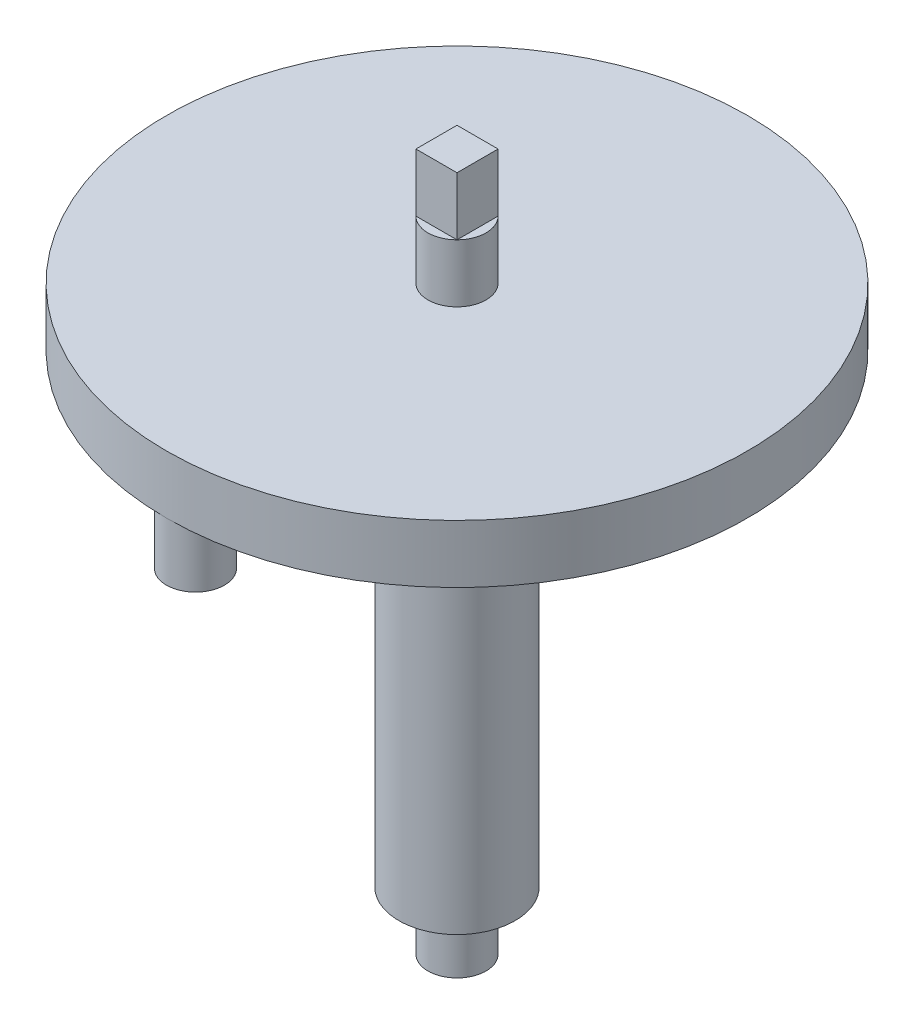
ISO-10303-21;
HEADER;
FILE_DESCRIPTION(('STEP AP214'),'2;1');
FILE_NAME('part.step','',(''),(''),'','','');
FILE_SCHEMA(('AUTOMOTIVE_DESIGN { 1 0 10303 214 1 1 1 1 }'));
ENDSEC;
DATA;
#1=APPLICATION_CONTEXT('core data for automotive mechanical design processes');
#2=APPLICATION_PROTOCOL_DEFINITION('international standard','automotive_design',2000,#1);
#3=PRODUCT_CONTEXT('',#1,'mechanical');
#4=PRODUCT('Part','Part','',(#3));
#5=PRODUCT_RELATED_PRODUCT_CATEGORY('part','',(#4));
#6=PRODUCT_DEFINITION_FORMATION('','',#4);
#7=PRODUCT_DEFINITION_CONTEXT('part definition',#1,'design');
#8=PRODUCT_DEFINITION('design','',#6,#7);
#9=PRODUCT_DEFINITION_SHAPE('','',#8);
#10=(LENGTH_UNIT() NAMED_UNIT(*) SI_UNIT(.MILLI.,.METRE.));
#11=(NAMED_UNIT(*) PLANE_ANGLE_UNIT() SI_UNIT($,.RADIAN.));
#12=(NAMED_UNIT(*) SI_UNIT($,.STERADIAN.) SOLID_ANGLE_UNIT());
#13=UNCERTAINTY_MEASURE_WITH_UNIT(LENGTH_MEASURE(1.E-05),#10,'distance_accuracy_value','');
#14=(GEOMETRIC_REPRESENTATION_CONTEXT(3) GLOBAL_UNCERTAINTY_ASSIGNED_CONTEXT((#13)) GLOBAL_UNIT_ASSIGNED_CONTEXT((#10,
#11,#12)) REPRESENTATION_CONTEXT('',''));
#15=CARTESIAN_POINT('',(0.,0.,0.));
#16=DIRECTION('',(0.,0.,1.));
#17=DIRECTION('',(1.,0.,0.));
#18=AXIS2_PLACEMENT_3D('',#15,#16,#17);
#19=CARTESIAN_POINT('',(0.,10.,0.));
#20=DIRECTION('',(0.,1.,0.));
#21=DIRECTION('',(0.,0.,1.));
#22=AXIS2_PLACEMENT_3D('',#19,#20,#21);
#23=PLANE('',#22);
#24=DIRECTION('',(0.,0.,1.));
#25=VECTOR('',#24,1.);
#26=CARTESIAN_POINT('',(-1.76776695296637,10.,-1.76776695296637));
#27=LINE('',#26,#25);
#28=CARTESIAN_POINT('',(-1.76776695296637,10.,-1.76776695296637));
#29=VERTEX_POINT('',#28);
#30=CARTESIAN_POINT('',(-1.76776695296637,10.,1.76776695296637));
#31=VERTEX_POINT('',#30);
#32=EDGE_CURVE('E58',#29,#31,#27,.T.);
#33=ORIENTED_EDGE('',*,*,#32,.F.);
#34=CARTESIAN_POINT('',(0.,10.,0.));
#35=DIRECTION('',(0.,1.,0.));
#36=DIRECTION('',(0.,0.,1.));
#37=AXIS2_PLACEMENT_3D('',#34,#35,#36);
#38=CIRCLE('',#37,2.5);
#39=EDGE_CURVE('E119',#29,#31,#38,.T.);
#40=ORIENTED_EDGE('',*,*,#39,.T.);
#41=EDGE_LOOP('',(#33,#40));
#42=FACE_BOUND('',#41,.T.);
#43=ADVANCED_FACE('F35',(#42),#23,.T.);
#44=DIRECTION('',(-1.,0.,0.));
#45=VECTOR('',#44,1.);
#46=CARTESIAN_POINT('',(1.76776695296637,10.,-1.76776695296637));
#47=LINE('',#46,#45);
#48=CARTESIAN_POINT('',(1.76776695296637,10.,-1.76776695296637));
#49=VERTEX_POINT('',#48);
#50=EDGE_CURVE('E114',#49,#29,#47,.T.);
#51=ORIENTED_EDGE('',*,*,#50,.F.);
#52=EDGE_CURVE('E128',#49,#29,#38,.T.);
#53=ORIENTED_EDGE('',*,*,#52,.T.);
#54=EDGE_LOOP('',(#51,#53));
#55=FACE_BOUND('',#54,.T.);
#56=ADVANCED_FACE('F189',(#55),#23,.T.);
#57=DIRECTION('',(0.,0.,-1.));
#58=VECTOR('',#57,1.);
#59=CARTESIAN_POINT('',(1.76776695296637,10.,-1.76776695296637));
#60=LINE('',#59,#58);
#61=CARTESIAN_POINT('',(1.76776695296637,10.,1.76776695296637));
#62=VERTEX_POINT('',#61);
#63=EDGE_CURVE('E216',#62,#49,#60,.T.);
#64=ORIENTED_EDGE('',*,*,#63,.F.);
#65=EDGE_CURVE('E121',#62,#49,#38,.T.);
#66=ORIENTED_EDGE('',*,*,#65,.T.);
#67=EDGE_LOOP('',(#64,#66));
#68=FACE_BOUND('',#67,.T.);
#69=ADVANCED_FACE('F196',(#68),#23,.T.);
#70=CARTESIAN_POINT('',(0.,0.,0.));
#71=DIRECTION('',(0.,1.,0.));
#72=DIRECTION('',(0.,0.,1.));
#73=AXIS2_PLACEMENT_3D('',#70,#71,#72);
#74=PLANE('',#73);
#75=CARTESIAN_POINT('',(0.,0.,0.));
#76=DIRECTION('',(0.,1.,0.));
#77=DIRECTION('',(0.,0.,1.));
#78=AXIS2_PLACEMENT_3D('',#75,#76,#77);
#79=CIRCLE('',#78,25.);
#80=CARTESIAN_POINT('',(0.,0.,25.));
#81=VERTEX_POINT('',#80);
#82=EDGE_CURVE('E39',#81,#81,#79,.T.);
#83=ORIENTED_EDGE('',*,*,#82,.F.);
#84=CARTESIAN_POINT('',(0.,0.,22.5));
#85=DIRECTION('',(0.,-1.,0.));
#86=DIRECTION('',(0.,0.,-1.));
#87=AXIS2_PLACEMENT_3D('',#84,#85,#86);
#88=CIRCLE('',#87,2.5);
#89=EDGE_CURVE('E154',#81,#81,#88,.T.);
#90=ORIENTED_EDGE('',*,*,#89,.F.);
#91=EDGE_LOOP('',(#83,#90));
#92=FACE_BOUND('',#91,.T.);
#93=CARTESIAN_POINT('',(0.,0.,32.));
#94=DIRECTION('',(0.,1.,0.));
#95=DIRECTION('',(0.,0.,-1.));
#96=AXIS2_PLACEMENT_3D('',#93,#94,#95);
#97=CIRCLE('',#96,25.);
#98=CARTESIAN_POINT('',(12.2986815699641,0.,10.234375));
#99=VERTEX_POINT('',#98);
#100=CARTESIAN_POINT('',(-12.2986815699641,0.,10.234375));
#101=VERTEX_POINT('',#100);
#102=EDGE_CURVE('E136',#99,#101,#97,.T.);
#103=ORIENTED_EDGE('',*,*,#102,.F.);
#104=CARTESIAN_POINT('',(0.,0.,0.));
#105=DIRECTION('',(0.,-1.,0.));
#106=DIRECTION('',(0.,0.,-1.));
#107=AXIS2_PLACEMENT_3D('',#104,#105,#106);
#108=CIRCLE('',#107,16.);
#109=EDGE_CURVE('E142',#101,#99,#108,.T.);
#110=ORIENTED_EDGE('',*,*,#109,.F.);
#111=EDGE_LOOP('',(#103,#110));
#112=FACE_BOUND('',#111,.T.);
#113=ADVANCED_FACE('F169',(#92,#112),#74,.F.);
#114=CARTESIAN_POINT('',(0.,5.,0.));
#115=DIRECTION('',(0.,1.,0.));
#116=DIRECTION('',(0.,0.,1.));
#117=AXIS2_PLACEMENT_3D('',#114,#115,#116);
#118=PLANE('',#117);
#119=CARTESIAN_POINT('',(0.,5.,0.));
#120=DIRECTION('',(0.,1.,0.));
#121=DIRECTION('',(0.,0.,1.));
#122=AXIS2_PLACEMENT_3D('',#119,#120,#121);
#123=CIRCLE('',#122,25.);
#124=CARTESIAN_POINT('',(0.,5.,25.));
#125=VERTEX_POINT('',#124);
#126=EDGE_CURVE('E44',#125,#125,#123,.T.);
#127=ORIENTED_EDGE('',*,*,#126,.T.);
#128=EDGE_LOOP('',(#127));
#129=FACE_BOUND('',#128,.T.);
#130=CARTESIAN_POINT('',(0.,5.,0.));
#131=DIRECTION('',(0.,1.,0.));
#132=DIRECTION('',(0.,0.,1.));
#133=AXIS2_PLACEMENT_3D('',#130,#131,#132);
#134=CIRCLE('',#133,2.5);
#135=CARTESIAN_POINT('',(0.,5.,2.5));
#136=VERTEX_POINT('',#135);
#137=EDGE_CURVE('E158',#136,#136,#134,.T.);
#138=ORIENTED_EDGE('',*,*,#137,.F.);
#139=EDGE_LOOP('',(#138));
#140=FACE_BOUND('',#139,.T.);
#141=ADVANCED_FACE('F184',(#129,#140),#118,.T.);
#142=CARTESIAN_POINT('',(0.,5.,0.));
#143=DIRECTION('',(0.,-1.,0.));
#144=DIRECTION('',(0.,0.,-1.));
#145=AXIS2_PLACEMENT_3D('',#142,#143,#144);
#146=CYLINDRICAL_SURFACE('',#145,25.);
#147=ORIENTED_EDGE('',*,*,#126,.F.);
#148=EDGE_LOOP('',(#147));
#149=FACE_BOUND('',#148,.T.);
#150=ORIENTED_EDGE('',*,*,#82,.T.);
#151=EDGE_LOOP('',(#150));
#152=FACE_BOUND('',#151,.T.);
#153=ADVANCED_FACE('F37',(#149,#152),#146,.T.);
#154=CARTESIAN_POINT('',(0.,-5.,22.5));
#155=DIRECTION('',(0.,1.,0.));
#156=DIRECTION('',(0.,0.,1.));
#157=AXIS2_PLACEMENT_3D('',#154,#155,#156);
#158=CYLINDRICAL_SURFACE('',#157,2.5);
#159=CARTESIAN_POINT('',(0.,-5.,22.5));
#160=DIRECTION('',(0.,-1.,0.));
#161=DIRECTION('',(0.,0.,-1.));
#162=AXIS2_PLACEMENT_3D('',#159,#160,#161);
#163=CIRCLE('',#162,2.5);
#164=CARTESIAN_POINT('',(0.,-5.,20.));
#165=VERTEX_POINT('',#164);
#166=EDGE_CURVE('E155',#165,#165,#163,.T.);
#167=ORIENTED_EDGE('',*,*,#166,.F.);
#168=EDGE_LOOP('',(#167));
#169=FACE_BOUND('',#168,.T.);
#170=ORIENTED_EDGE('',*,*,#89,.T.);
#171=EDGE_LOOP('',(#170));
#172=FACE_BOUND('',#171,.T.);
#173=ADVANCED_FACE('F172',(#169,#172),#158,.T.);
#174=CARTESIAN_POINT('',(0.,-5.,22.5));
#175=DIRECTION('',(0.,-1.,0.));
#176=DIRECTION('',(0.,0.,-1.));
#177=AXIS2_PLACEMENT_3D('',#174,#175,#176);
#178=PLANE('',#177);
#179=ORIENTED_EDGE('',*,*,#166,.T.);
#180=EDGE_LOOP('',(#179));
#181=FACE_BOUND('',#180,.T.);
#182=ADVANCED_FACE('F174',(#181),#178,.T.);
#183=CARTESIAN_POINT('',(0.,-5.,16.));
#184=DIRECTION('',(0.,-1.,0.));
#185=DIRECTION('',(0.,0.,-1.));
#186=AXIS2_PLACEMENT_3D('',#183,#184,#185);
#187=PLANE('',#186);
#188=CARTESIAN_POINT('',(0.,-5.,0.));
#189=DIRECTION('',(0.,-1.,0.));
#190=DIRECTION('',(0.,0.,-1.));
#191=AXIS2_PLACEMENT_3D('',#188,#189,#190);
#192=CIRCLE('',#191,5.);
#193=CARTESIAN_POINT('',(0.,-5.,-5.));
#194=VERTEX_POINT('',#193);
#195=EDGE_CURVE('E12',#194,#194,#192,.T.);
#196=ORIENTED_EDGE('',*,*,#195,.F.);
#197=EDGE_LOOP('',(#196));
#198=FACE_BOUND('',#197,.T.);
#199=CARTESIAN_POINT('',(0.,-5.,32.));
#200=DIRECTION('',(0.,1.,0.));
#201=DIRECTION('',(0.,0.,-1.));
#202=AXIS2_PLACEMENT_3D('',#199,#200,#201);
#203=CIRCLE('',#202,25.);
#204=CARTESIAN_POINT('',(12.2986815699641,-5.,10.234375));
#205=VERTEX_POINT('',#204);
#206=CARTESIAN_POINT('',(-12.2986815699641,-5.,10.234375));
#207=VERTEX_POINT('',#206);
#208=EDGE_CURVE('E138',#205,#207,#203,.T.);
#209=ORIENTED_EDGE('',*,*,#208,.T.);
#210=CARTESIAN_POINT('',(0.,-5.,0.));
#211=DIRECTION('',(0.,-1.,0.));
#212=DIRECTION('',(0.,0.,-1.));
#213=AXIS2_PLACEMENT_3D('',#210,#211,#212);
#214=CIRCLE('',#213,16.);
#215=EDGE_CURVE('E141',#207,#205,#214,.T.);
#216=ORIENTED_EDGE('',*,*,#215,.T.);
#217=EDGE_LOOP('',(#209,#216));
#218=FACE_BOUND('',#217,.T.);
#219=ADVANCED_FACE('F181',(#198,#218),#187,.T.);
#220=CARTESIAN_POINT('',(0.,-5.,32.));
#221=DIRECTION('',(0.,1.,0.));
#222=DIRECTION('',(0.,0.,1.));
#223=AXIS2_PLACEMENT_3D('',#220,#221,#222);
#224=CYLINDRICAL_SURFACE('',#223,25.);
#225=ORIENTED_EDGE('',*,*,#102,.T.);
#226=DIRECTION('',(0.,1.,0.));
#227=VECTOR('',#226,1.);
#228=CARTESIAN_POINT('',(-12.2986815699641,-5.,10.234375));
#229=LINE('',#228,#227);
#230=EDGE_CURVE('E151',#207,#101,#229,.T.);
#231=ORIENTED_EDGE('',*,*,#230,.F.);
#232=ORIENTED_EDGE('',*,*,#208,.F.);
#233=DIRECTION('',(0.,1.,0.));
#234=VECTOR('',#233,1.);
#235=CARTESIAN_POINT('',(12.2986815699641,-5.,10.234375));
#236=LINE('',#235,#234);
#237=EDGE_CURVE('E144',#205,#99,#236,.T.);
#238=ORIENTED_EDGE('',*,*,#237,.T.);
#239=EDGE_LOOP('',(#225,#231,#232,#238));
#240=FACE_BOUND('',#239,.T.);
#241=ADVANCED_FACE('F335',(#240),#224,.F.);
#242=CARTESIAN_POINT('',(0.,-5.,0.));
#243=DIRECTION('',(0.,1.,0.));
#244=DIRECTION('',(0.,0.,1.));
#245=AXIS2_PLACEMENT_3D('',#242,#243,#244);
#246=CYLINDRICAL_SURFACE('',#245,16.);
#247=ORIENTED_EDGE('',*,*,#109,.T.);
#248=ORIENTED_EDGE('',*,*,#237,.F.);
#249=ORIENTED_EDGE('',*,*,#215,.F.);
#250=ORIENTED_EDGE('',*,*,#230,.T.);
#251=EDGE_LOOP('',(#247,#248,#249,#250));
#252=FACE_BOUND('',#251,.T.);
#253=ADVANCED_FACE('F325',(#252),#246,.T.);
#254=CARTESIAN_POINT('',(0.,-40.,0.));
#255=DIRECTION('',(0.,-1.,0.));
#256=DIRECTION('',(0.,0.,-1.));
#257=AXIS2_PLACEMENT_3D('',#254,#255,#256);
#258=PLANE('',#257);
#259=CARTESIAN_POINT('',(0.,-40.,0.));
#260=DIRECTION('',(0.,-1.,0.));
#261=DIRECTION('',(0.,0.,-1.));
#262=AXIS2_PLACEMENT_3D('',#259,#260,#261);
#263=CIRCLE('',#262,5.);
#264=CARTESIAN_POINT('',(0.,-40.,-5.));
#265=VERTEX_POINT('',#264);
#266=EDGE_CURVE('E134',#265,#265,#263,.T.);
#267=ORIENTED_EDGE('',*,*,#266,.T.);
#268=EDGE_LOOP('',(#267));
#269=FACE_BOUND('',#268,.T.);
#270=CARTESIAN_POINT('',(0.,-40.,0.));
#271=DIRECTION('',(0.,-1.,0.));
#272=DIRECTION('',(0.,0.,-1.));
#273=AXIS2_PLACEMENT_3D('',#270,#271,#272);
#274=CIRCLE('',#273,2.5);
#275=CARTESIAN_POINT('',(0.,-40.,-2.5));
#276=VERTEX_POINT('',#275);
#277=EDGE_CURVE('E131',#276,#276,#274,.T.);
#278=ORIENTED_EDGE('',*,*,#277,.F.);
#279=EDGE_LOOP('',(#278));
#280=FACE_BOUND('',#279,.T.);
#281=ADVANCED_FACE('F316',(#269,#280),#258,.T.);
#282=CARTESIAN_POINT('',(0.,-40.,0.));
#283=DIRECTION('',(0.,1.,0.));
#284=DIRECTION('',(0.,0.,1.));
#285=AXIS2_PLACEMENT_3D('',#282,#283,#284);
#286=CYLINDRICAL_SURFACE('',#285,5.);
#287=ORIENTED_EDGE('',*,*,#266,.F.);
#288=EDGE_LOOP('',(#287));
#289=FACE_BOUND('',#288,.T.);
#290=ORIENTED_EDGE('',*,*,#195,.T.);
#291=EDGE_LOOP('',(#290));
#292=FACE_BOUND('',#291,.T.);
#293=ADVANCED_FACE('F307',(#289,#292),#286,.T.);
#294=CARTESIAN_POINT('',(0.,-45.,0.));
#295=DIRECTION('',(0.,-1.,0.));
#296=DIRECTION('',(0.,0.,-1.));
#297=AXIS2_PLACEMENT_3D('',#294,#295,#296);
#298=PLANE('',#297);
#299=CARTESIAN_POINT('',(0.,-45.,0.));
#300=DIRECTION('',(0.,-1.,0.));
#301=DIRECTION('',(0.,0.,-1.));
#302=AXIS2_PLACEMENT_3D('',#299,#300,#301);
#303=CIRCLE('',#302,2.5);
#304=CARTESIAN_POINT('',(0.,-45.,-2.5));
#305=VERTEX_POINT('',#304);
#306=EDGE_CURVE('E127',#305,#305,#303,.F.);
#307=ORIENTED_EDGE('',*,*,#306,.F.);
#308=EDGE_LOOP('',(#307));
#309=FACE_BOUND('',#308,.T.);
#310=ADVANCED_FACE('F299',(#309),#298,.T.);
#311=CARTESIAN_POINT('',(0.,-57.0710678118655,0.));
#312=DIRECTION('',(0.,1.,0.));
#313=DIRECTION('',(0.,0.,1.));
#314=AXIS2_PLACEMENT_3D('',#311,#312,#313);
#315=CYLINDRICAL_SURFACE('',#314,2.5);
#316=ORIENTED_EDGE('',*,*,#277,.T.);
#317=EDGE_LOOP('',(#316));
#318=FACE_BOUND('',#317,.T.);
#319=ORIENTED_EDGE('',*,*,#306,.T.);
#320=EDGE_LOOP('',(#319));
#321=FACE_BOUND('',#320,.T.);
#322=ADVANCED_FACE('F207',(#318,#321),#315,.T.);
#323=ORIENTED_EDGE('',*,*,#137,.T.);
#324=EDGE_LOOP('',(#323));
#325=FACE_BOUND('',#324,.T.);
#326=ORIENTED_EDGE('',*,*,#65,.F.);
#327=EDGE_CURVE('E117',#31,#62,#38,.T.);
#328=ORIENTED_EDGE('',*,*,#327,.F.);
#329=ORIENTED_EDGE('',*,*,#39,.F.);
#330=ORIENTED_EDGE('',*,*,#52,.F.);
#331=EDGE_LOOP('',(#326,#328,#329,#330));
#332=FACE_BOUND('',#331,.T.);
#333=ADVANCED_FACE('F201',(#325,#332),#315,.T.);
#334=DIRECTION('',(1.,0.,0.));
#335=VECTOR('',#334,1.);
#336=CARTESIAN_POINT('',(1.76776695296637,10.,1.76776695296637));
#337=LINE('',#336,#335);
#338=EDGE_CURVE('E51',#31,#62,#337,.T.);
#339=ORIENTED_EDGE('',*,*,#338,.F.);
#340=ORIENTED_EDGE('',*,*,#327,.T.);
#341=EDGE_LOOP('',(#339,#340));
#342=FACE_BOUND('',#341,.T.);
#343=ADVANCED_FACE('F191',(#342),#23,.T.);
#344=CARTESIAN_POINT('',(-1.76776695296637,15.,-1.76776695296637));
#345=DIRECTION('',(1.,0.,0.));
#346=DIRECTION('',(0.,0.,-1.));
#347=AXIS2_PLACEMENT_3D('',#344,#345,#346);
#348=PLANE('',#347);
#349=ORIENTED_EDGE('',*,*,#32,.T.);
#350=DIRECTION('',(0.,-1.,0.));
#351=VECTOR('',#350,1.);
#352=CARTESIAN_POINT('',(-1.76776695296637,15.,1.76776695296637));
#353=LINE('',#352,#351);
#354=CARTESIAN_POINT('',(-1.76776695296637,15.,1.76776695296637));
#355=VERTEX_POINT('',#354);
#356=EDGE_CURVE('E99',#355,#31,#353,.T.);
#357=ORIENTED_EDGE('',*,*,#356,.F.);
#358=DIRECTION('',(0.,0.,1.));
#359=VECTOR('',#358,1.);
#360=CARTESIAN_POINT('',(-1.76776695296637,15.,-1.76776695296637));
#361=LINE('',#360,#359);
#362=CARTESIAN_POINT('',(-1.76776695296637,15.,-1.76776695296637));
#363=VERTEX_POINT('',#362);
#364=EDGE_CURVE('E105',#363,#355,#361,.T.);
#365=ORIENTED_EDGE('',*,*,#364,.F.);
#366=DIRECTION('',(0.,-1.,0.));
#367=VECTOR('',#366,1.);
#368=CARTESIAN_POINT('',(-1.76776695296637,15.,-1.76776695296637));
#369=LINE('',#368,#367);
#370=EDGE_CURVE('E224',#363,#29,#369,.T.);
#371=ORIENTED_EDGE('',*,*,#370,.T.);
#372=EDGE_LOOP('',(#349,#357,#365,#371));
#373=FACE_BOUND('',#372,.T.);
#374=ADVANCED_FACE('F116',(#373),#348,.F.);
#375=CARTESIAN_POINT('',(1.76776695296637,15.,1.76776695296637));
#376=DIRECTION('',(0.,0.,-1.));
#377=DIRECTION('',(-1.,0.,0.));
#378=AXIS2_PLACEMENT_3D('',#375,#376,#377);
#379=PLANE('',#378);
#380=ORIENTED_EDGE('',*,*,#338,.T.);
#381=DIRECTION('',(0.,-1.,0.));
#382=VECTOR('',#381,1.);
#383=CARTESIAN_POINT('',(1.76776695296637,15.,1.76776695296637));
#384=LINE('',#383,#382);
#385=CARTESIAN_POINT('',(1.76776695296637,15.,1.76776695296637));
#386=VERTEX_POINT('',#385);
#387=EDGE_CURVE('E101',#386,#62,#384,.T.);
#388=ORIENTED_EDGE('',*,*,#387,.F.);
#389=DIRECTION('',(1.,0.,0.));
#390=VECTOR('',#389,1.);
#391=CARTESIAN_POINT('',(1.76776695296637,15.,1.76776695296637));
#392=LINE('',#391,#390);
#393=EDGE_CURVE('E95',#355,#386,#392,.T.);
#394=ORIENTED_EDGE('',*,*,#393,.F.);
#395=ORIENTED_EDGE('',*,*,#356,.T.);
#396=EDGE_LOOP('',(#380,#388,#394,#395));
#397=FACE_BOUND('',#396,.T.);
#398=ADVANCED_FACE('F97',(#397),#379,.F.);
#399=CARTESIAN_POINT('',(1.76776695296637,15.,-1.76776695296637));
#400=DIRECTION('',(-1.,0.,0.));
#401=DIRECTION('',(0.,0.,1.));
#402=AXIS2_PLACEMENT_3D('',#399,#400,#401);
#403=PLANE('',#402);
#404=ORIENTED_EDGE('',*,*,#63,.T.);
#405=DIRECTION('',(0.,-1.,0.));
#406=VECTOR('',#405,1.);
#407=CARTESIAN_POINT('',(1.76776695296637,15.,-1.76776695296637));
#408=LINE('',#407,#406);
#409=CARTESIAN_POINT('',(1.76776695296637,15.,-1.76776695296637));
#410=VERTEX_POINT('',#409);
#411=EDGE_CURVE('E122',#410,#49,#408,.T.);
#412=ORIENTED_EDGE('',*,*,#411,.F.);
#413=DIRECTION('',(0.,0.,-1.));
#414=VECTOR('',#413,1.);
#415=CARTESIAN_POINT('',(1.76776695296637,15.,-1.76776695296637));
#416=LINE('',#415,#414);
#417=EDGE_CURVE('E104',#386,#410,#416,.T.);
#418=ORIENTED_EDGE('',*,*,#417,.F.);
#419=ORIENTED_EDGE('',*,*,#387,.T.);
#420=EDGE_LOOP('',(#404,#412,#418,#419));
#421=FACE_BOUND('',#420,.T.);
#422=ADVANCED_FACE('F222',(#421),#403,.F.);
#423=CARTESIAN_POINT('',(1.76776695296637,15.,-1.76776695296637));
#424=DIRECTION('',(0.,0.,1.));
#425=DIRECTION('',(1.,0.,0.));
#426=AXIS2_PLACEMENT_3D('',#423,#424,#425);
#427=PLANE('',#426);
#428=ORIENTED_EDGE('',*,*,#50,.T.);
#429=ORIENTED_EDGE('',*,*,#370,.F.);
#430=DIRECTION('',(-1.,0.,0.));
#431=VECTOR('',#430,1.);
#432=CARTESIAN_POINT('',(1.76776695296637,15.,-1.76776695296637));
#433=LINE('',#432,#431);
#434=EDGE_CURVE('E110',#410,#363,#433,.T.);
#435=ORIENTED_EDGE('',*,*,#434,.F.);
#436=ORIENTED_EDGE('',*,*,#411,.T.);
#437=EDGE_LOOP('',(#428,#429,#435,#436));
#438=FACE_BOUND('',#437,.T.);
#439=ADVANCED_FACE('F231',(#438),#427,.F.);
#440=CARTESIAN_POINT('',(0.,15.,0.));
#441=DIRECTION('',(0.,-1.,0.));
#442=DIRECTION('',(0.,0.,-1.));
#443=AXIS2_PLACEMENT_3D('',#440,#441,#442);
#444=PLANE('',#443);
#445=ORIENTED_EDGE('',*,*,#364,.T.);
#446=ORIENTED_EDGE('',*,*,#393,.T.);
#447=ORIENTED_EDGE('',*,*,#417,.T.);
#448=ORIENTED_EDGE('',*,*,#434,.T.);
#449=EDGE_LOOP('',(#445,#446,#447,#448));
#450=FACE_BOUND('',#449,.T.);
#451=ADVANCED_FACE('F108',(#450),#444,.F.);
#452=CLOSED_SHELL('',(#43,#56,#69,#113,#141,#153,#173,#182,#219,#241,#253,#281,#293,#310,#322,
#333,#343,#374,#398,#422,#439,#451));
#453=MANIFOLD_SOLID_BREP('B2',#452);
#454=ADVANCED_BREP_SHAPE_REPRESENTATION('',(#18,#453),#14);
#455=SHAPE_DEFINITION_REPRESENTATION(#9,#454);
ENDSEC;
END-ISO-10303-21;
